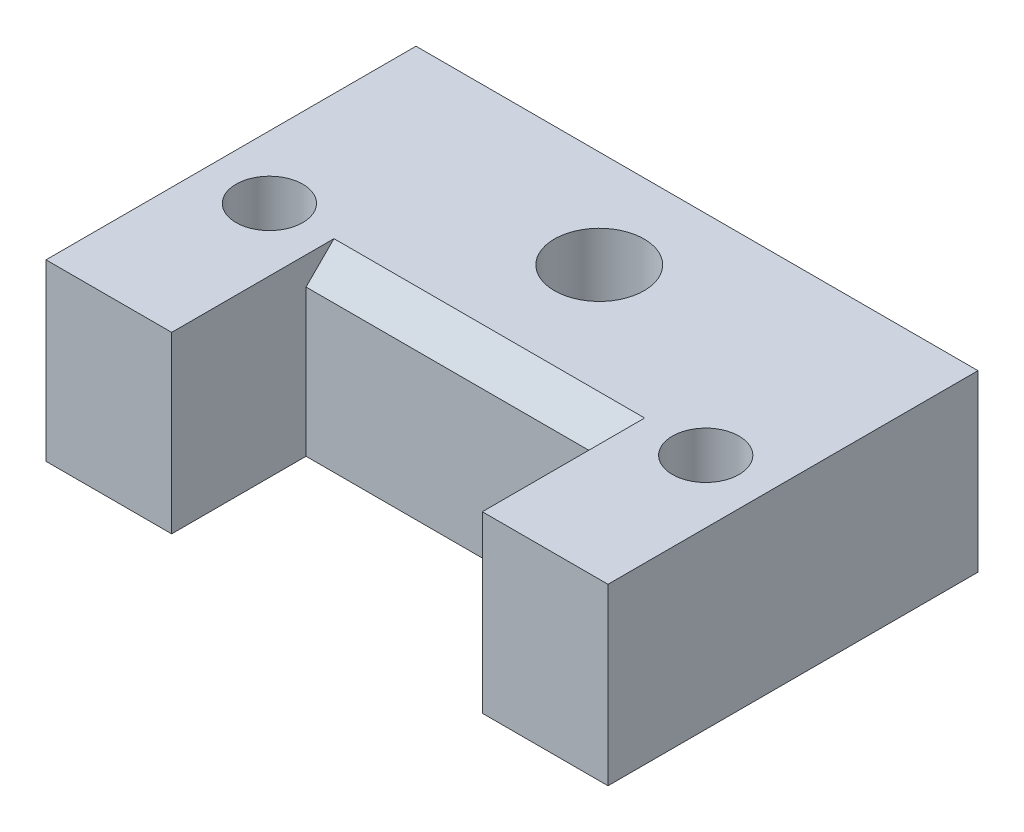
ISO-10303-21;
HEADER;
FILE_DESCRIPTION(('STEP AP214'),'2;1');
FILE_NAME('part.step','',(''),(''),'','','');
FILE_SCHEMA(('AUTOMOTIVE_DESIGN { 1 0 10303 214 1 1 1 1 }'));
ENDSEC;
DATA;
#1=APPLICATION_CONTEXT('core data for automotive mechanical design processes');
#2=APPLICATION_PROTOCOL_DEFINITION('international standard','automotive_design',2000,#1);
#3=PRODUCT_CONTEXT('',#1,'mechanical');
#4=PRODUCT('Part','Part','',(#3));
#5=PRODUCT_RELATED_PRODUCT_CATEGORY('part','',(#4));
#6=PRODUCT_DEFINITION_FORMATION('','',#4);
#7=PRODUCT_DEFINITION_CONTEXT('part definition',#1,'design');
#8=PRODUCT_DEFINITION('design','',#6,#7);
#9=PRODUCT_DEFINITION_SHAPE('','',#8);
#10=(LENGTH_UNIT() NAMED_UNIT(*) SI_UNIT(.MILLI.,.METRE.));
#11=(NAMED_UNIT(*) PLANE_ANGLE_UNIT() SI_UNIT($,.RADIAN.));
#12=(NAMED_UNIT(*) SI_UNIT($,.STERADIAN.) SOLID_ANGLE_UNIT());
#13=UNCERTAINTY_MEASURE_WITH_UNIT(LENGTH_MEASURE(1.E-05),#10,'distance_accuracy_value','');
#14=(GEOMETRIC_REPRESENTATION_CONTEXT(3) GLOBAL_UNCERTAINTY_ASSIGNED_CONTEXT((#13)) GLOBAL_UNIT_ASSIGNED_CONTEXT((#10,
#11,#12)) REPRESENTATION_CONTEXT('',''));
#15=CARTESIAN_POINT('',(0.,0.,0.));
#16=DIRECTION('',(0.,0.,1.));
#17=DIRECTION('',(1.,0.,0.));
#18=AXIS2_PLACEMENT_3D('',#15,#16,#17);
#19=CARTESIAN_POINT('',(-20.447,12.7,13.462));
#20=DIRECTION('',(0.,0.,-1.));
#21=DIRECTION('',(-1.,0.,0.));
#22=AXIS2_PLACEMENT_3D('',#19,#20,#21);
#23=PLANE('',#22);
#24=DIRECTION('',(1.,0.,0.));
#25=VECTOR('',#24,1.);
#26=CARTESIAN_POINT('',(-20.447,0.,13.462));
#27=LINE('',#26,#25);
#28=CARTESIAN_POINT('',(-20.447,0.,13.462));
#29=VERTEX_POINT('',#28);
#30=CARTESIAN_POINT('',(-11.303,0.,13.462));
#31=VERTEX_POINT('',#30);
#32=EDGE_CURVE('E136',#29,#31,#27,.T.);
#33=ORIENTED_EDGE('',*,*,#32,.T.);
#34=DIRECTION('',(0.,1.,0.));
#35=VECTOR('',#34,1.);
#36=CARTESIAN_POINT('',(-11.303,0.,13.462));
#37=LINE('',#36,#35);
#38=CARTESIAN_POINT('',(-11.303,12.7,13.462));
#39=VERTEX_POINT('',#38);
#40=EDGE_CURVE('E119',#31,#39,#37,.T.);
#41=ORIENTED_EDGE('',*,*,#40,.T.);
#42=DIRECTION('',(1.,0.,0.));
#43=VECTOR('',#42,1.);
#44=CARTESIAN_POINT('',(-20.447,12.7,13.462));
#45=LINE('',#44,#43);
#46=CARTESIAN_POINT('',(-20.447,12.7,13.462));
#47=VERTEX_POINT('',#46);
#48=EDGE_CURVE('E162',#47,#39,#45,.T.);
#49=ORIENTED_EDGE('',*,*,#48,.F.);
#50=DIRECTION('',(0.,-1.,0.));
#51=VECTOR('',#50,1.);
#52=CARTESIAN_POINT('',(-20.447,12.7,13.462));
#53=LINE('',#52,#51);
#54=EDGE_CURVE('E143',#47,#29,#53,.T.);
#55=ORIENTED_EDGE('',*,*,#54,.T.);
#56=EDGE_LOOP('',(#33,#41,#49,#55));
#57=FACE_BOUND('',#56,.T.);
#58=ADVANCED_FACE('F47',(#57),#23,.F.);
#59=CARTESIAN_POINT('',(20.447,12.7,-13.462));
#60=DIRECTION('',(-1.,0.,0.));
#61=DIRECTION('',(0.,0.,1.));
#62=AXIS2_PLACEMENT_3D('',#59,#60,#61);
#63=PLANE('',#62);
#64=DIRECTION('',(0.,0.,-1.));
#65=VECTOR('',#64,1.);
#66=CARTESIAN_POINT('',(20.447,0.,-13.462));
#67=LINE('',#66,#65);
#68=CARTESIAN_POINT('',(20.447,0.,13.462));
#69=VERTEX_POINT('',#68);
#70=CARTESIAN_POINT('',(20.447,0.,-13.462));
#71=VERTEX_POINT('',#70);
#72=EDGE_CURVE('E206',#69,#71,#67,.T.);
#73=ORIENTED_EDGE('',*,*,#72,.T.);
#74=DIRECTION('',(0.,-1.,0.));
#75=VECTOR('',#74,1.);
#76=CARTESIAN_POINT('',(20.447,12.7,-13.462));
#77=LINE('',#76,#75);
#78=CARTESIAN_POINT('',(20.447,12.7,-13.462));
#79=VERTEX_POINT('',#78);
#80=EDGE_CURVE('E169',#79,#71,#77,.T.);
#81=ORIENTED_EDGE('',*,*,#80,.F.);
#82=DIRECTION('',(0.,0.,-1.));
#83=VECTOR('',#82,1.);
#84=CARTESIAN_POINT('',(20.447,12.7,-13.462));
#85=LINE('',#84,#83);
#86=CARTESIAN_POINT('',(20.447,12.7,13.462));
#87=VERTEX_POINT('',#86);
#88=EDGE_CURVE('E145',#87,#79,#85,.T.);
#89=ORIENTED_EDGE('',*,*,#88,.F.);
#90=DIRECTION('',(0.,-1.,0.));
#91=VECTOR('',#90,1.);
#92=CARTESIAN_POINT('',(20.447,12.7,13.462));
#93=LINE('',#92,#91);
#94=EDGE_CURVE('E158',#87,#69,#93,.T.);
#95=ORIENTED_EDGE('',*,*,#94,.T.);
#96=EDGE_LOOP('',(#73,#81,#89,#95));
#97=FACE_BOUND('',#96,.T.);
#98=ADVANCED_FACE('F223',(#97),#63,.F.);
#99=CARTESIAN_POINT('',(-20.447,12.7,-13.462));
#100=DIRECTION('',(0.,0.,1.));
#101=DIRECTION('',(1.,0.,0.));
#102=AXIS2_PLACEMENT_3D('',#99,#100,#101);
#103=PLANE('',#102);
#104=DIRECTION('',(-1.,0.,0.));
#105=VECTOR('',#104,1.);
#106=CARTESIAN_POINT('',(-20.447,0.,-13.462));
#107=LINE('',#106,#105);
#108=CARTESIAN_POINT('',(-20.447,0.,-13.462));
#109=VERTEX_POINT('',#108);
#110=EDGE_CURVE('E209',#71,#109,#107,.T.);
#111=ORIENTED_EDGE('',*,*,#110,.T.);
#112=DIRECTION('',(0.,-1.,0.));
#113=VECTOR('',#112,1.);
#114=CARTESIAN_POINT('',(-20.447,12.7,-13.462));
#115=LINE('',#114,#113);
#116=CARTESIAN_POINT('',(-20.447,12.7,-13.462));
#117=VERTEX_POINT('',#116);
#118=EDGE_CURVE('E165',#117,#109,#115,.T.);
#119=ORIENTED_EDGE('',*,*,#118,.F.);
#120=DIRECTION('',(-1.,0.,0.));
#121=VECTOR('',#120,1.);
#122=CARTESIAN_POINT('',(-20.447,12.7,-13.462));
#123=LINE('',#122,#121);
#124=EDGE_CURVE('E152',#79,#117,#123,.T.);
#125=ORIENTED_EDGE('',*,*,#124,.F.);
#126=ORIENTED_EDGE('',*,*,#80,.T.);
#127=EDGE_LOOP('',(#111,#119,#125,#126));
#128=FACE_BOUND('',#127,.T.);
#129=ADVANCED_FACE('F221',(#128),#103,.F.);
#130=CARTESIAN_POINT('',(-20.447,12.7,-13.462));
#131=DIRECTION('',(1.,0.,0.));
#132=DIRECTION('',(0.,0.,-1.));
#133=AXIS2_PLACEMENT_3D('',#130,#131,#132);
#134=PLANE('',#133);
#135=DIRECTION('',(0.,0.,1.));
#136=VECTOR('',#135,1.);
#137=CARTESIAN_POINT('',(-20.447,0.,-13.462));
#138=LINE('',#137,#136);
#139=EDGE_CURVE('E154',#109,#29,#138,.T.);
#140=ORIENTED_EDGE('',*,*,#139,.T.);
#141=ORIENTED_EDGE('',*,*,#54,.F.);
#142=DIRECTION('',(0.,0.,1.));
#143=VECTOR('',#142,1.);
#144=CARTESIAN_POINT('',(-20.447,12.7,-13.462));
#145=LINE('',#144,#143);
#146=EDGE_CURVE('E198',#117,#47,#145,.T.);
#147=ORIENTED_EDGE('',*,*,#146,.F.);
#148=ORIENTED_EDGE('',*,*,#118,.T.);
#149=EDGE_LOOP('',(#140,#141,#147,#148));
#150=FACE_BOUND('',#149,.T.);
#151=ADVANCED_FACE('F217',(#150),#134,.F.);
#152=CARTESIAN_POINT('',(11.303,12.7,13.462));
#153=VERTEX_POINT('',#152);
#154=EDGE_CURVE('E188',#153,#87,#45,.T.);
#155=ORIENTED_EDGE('',*,*,#154,.F.);
#156=DIRECTION('',(0.,1.,0.));
#157=VECTOR('',#156,1.);
#158=CARTESIAN_POINT('',(11.303,0.,13.462));
#159=LINE('',#158,#157);
#160=CARTESIAN_POINT('',(11.303,0.,13.462));
#161=VERTEX_POINT('',#160);
#162=EDGE_CURVE('E129',#161,#153,#159,.T.);
#163=ORIENTED_EDGE('',*,*,#162,.F.);
#164=EDGE_CURVE('E146',#161,#69,#27,.T.);
#165=ORIENTED_EDGE('',*,*,#164,.T.);
#166=ORIENTED_EDGE('',*,*,#94,.F.);
#167=EDGE_LOOP('',(#155,#163,#165,#166));
#168=FACE_BOUND('',#167,.T.);
#169=ADVANCED_FACE('F194',(#168),#23,.F.);
#170=CARTESIAN_POINT('',(0.,12.7,0.));
#171=DIRECTION('',(0.,1.,0.));
#172=DIRECTION('',(0.,0.,1.));
#173=AXIS2_PLACEMENT_3D('',#170,#171,#172);
#174=PLANE('',#173);
#175=CARTESIAN_POINT('',(0.,12.7,-6.35));
#176=DIRECTION('',(0.,1.,0.));
#177=DIRECTION('',(0.,0.,1.));
#178=AXIS2_PLACEMENT_3D('',#175,#176,#177);
#179=CIRCLE('',#178,3.26389999999999);
#180=CARTESIAN_POINT('',(0.,12.7,-3.08610000000002));
#181=VERTEX_POINT('',#180);
#182=EDGE_CURVE('E261',#181,#181,#179,.T.);
#183=ORIENTED_EDGE('',*,*,#182,.F.);
#184=EDGE_LOOP('',(#183));
#185=FACE_BOUND('',#184,.T.);
#186=CARTESIAN_POINT('',(-15.875,12.7,1.77799999999999));
#187=DIRECTION('',(0.,1.,0.));
#188=DIRECTION('',(0.,0.,1.));
#189=AXIS2_PLACEMENT_3D('',#186,#187,#188);
#190=CIRCLE('',#189,2.4257);
#191=CARTESIAN_POINT('',(-15.875,12.7,4.20369999999999));
#192=VERTEX_POINT('',#191);
#193=EDGE_CURVE('E251',#192,#192,#190,.T.);
#194=ORIENTED_EDGE('',*,*,#193,.F.);
#195=EDGE_LOOP('',(#194));
#196=FACE_BOUND('',#195,.T.);
#197=CARTESIAN_POINT('',(15.875,12.7,1.77799999999999));
#198=DIRECTION('',(0.,1.,0.));
#199=DIRECTION('',(0.,0.,1.));
#200=AXIS2_PLACEMENT_3D('',#197,#198,#199);
#201=CIRCLE('',#200,2.4257);
#202=CARTESIAN_POINT('',(15.875,12.7,4.20369999999999));
#203=VERTEX_POINT('',#202);
#204=EDGE_CURVE('E246',#203,#203,#201,.T.);
#205=ORIENTED_EDGE('',*,*,#204,.F.);
#206=EDGE_LOOP('',(#205));
#207=FACE_BOUND('',#206,.T.);
#208=DIRECTION('',(0.,0.,1.));
#209=VECTOR('',#208,1.);
#210=CARTESIAN_POINT('',(-11.303,12.7,13.462));
#211=LINE('',#210,#209);
#212=CARTESIAN_POINT('',(-11.303,12.7,1.65099999999999));
#213=VERTEX_POINT('',#212);
#214=EDGE_CURVE('E64',#213,#39,#211,.T.);
#215=ORIENTED_EDGE('',*,*,#214,.F.);
#216=DIRECTION('',(1.,0.,0.));
#217=VECTOR('',#216,1.);
#218=CARTESIAN_POINT('',(11.303,12.7,1.65099999999999));
#219=LINE('',#218,#217);
#220=CARTESIAN_POINT('',(11.303,12.7,1.65099999999999));
#221=VERTEX_POINT('',#220);
#222=EDGE_CURVE('E177',#213,#221,#219,.T.);
#223=ORIENTED_EDGE('',*,*,#222,.T.);
#224=DIRECTION('',(0.,0.,-1.));
#225=VECTOR('',#224,1.);
#226=CARTESIAN_POINT('',(11.303,12.7,13.462));
#227=LINE('',#226,#225);
#228=EDGE_CURVE('E71',#153,#221,#227,.T.);
#229=ORIENTED_EDGE('',*,*,#228,.F.);
#230=ORIENTED_EDGE('',*,*,#154,.T.);
#231=ORIENTED_EDGE('',*,*,#88,.T.);
#232=ORIENTED_EDGE('',*,*,#124,.T.);
#233=ORIENTED_EDGE('',*,*,#146,.T.);
#234=ORIENTED_EDGE('',*,*,#48,.T.);
#235=EDGE_LOOP('',(#215,#223,#229,#230,#231,#232,#233,#234));
#236=FACE_BOUND('',#235,.T.);
#237=ADVANCED_FACE('F186',(#185,#196,#207,#236),#174,.T.);
#238=CARTESIAN_POINT('',(0.,0.,0.));
#239=DIRECTION('',(0.,1.,0.));
#240=DIRECTION('',(0.,0.,1.));
#241=AXIS2_PLACEMENT_3D('',#238,#239,#240);
#242=PLANE('',#241);
#243=CARTESIAN_POINT('',(0.,0.,-6.35));
#244=DIRECTION('',(0.,1.,0.));
#245=DIRECTION('',(0.,0.,1.));
#246=AXIS2_PLACEMENT_3D('',#243,#244,#245);
#247=CIRCLE('',#246,3.2639);
#248=CARTESIAN_POINT('',(0.,0.,-3.08610000000001));
#249=VERTEX_POINT('',#248);
#250=EDGE_CURVE('E247',#249,#249,#247,.T.);
#251=ORIENTED_EDGE('',*,*,#250,.T.);
#252=EDGE_LOOP('',(#251));
#253=FACE_BOUND('',#252,.T.);
#254=CARTESIAN_POINT('',(-15.875,0.,1.77799999999999));
#255=DIRECTION('',(0.,1.,0.));
#256=DIRECTION('',(0.,0.,1.));
#257=AXIS2_PLACEMENT_3D('',#254,#255,#256);
#258=CIRCLE('',#257,2.4257);
#259=CARTESIAN_POINT('',(-15.875,0.,4.20369999999999));
#260=VERTEX_POINT('',#259);
#261=EDGE_CURVE('E237',#260,#260,#258,.T.);
#262=ORIENTED_EDGE('',*,*,#261,.T.);
#263=EDGE_LOOP('',(#262));
#264=FACE_BOUND('',#263,.T.);
#265=CARTESIAN_POINT('',(15.875,0.,1.77799999999999));
#266=DIRECTION('',(0.,1.,0.));
#267=DIRECTION('',(0.,0.,1.));
#268=AXIS2_PLACEMENT_3D('',#265,#266,#267);
#269=CIRCLE('',#268,2.4257);
#270=CARTESIAN_POINT('',(15.875,0.,4.20369999999999));
#271=VERTEX_POINT('',#270);
#272=EDGE_CURVE('E242',#271,#271,#269,.T.);
#273=ORIENTED_EDGE('',*,*,#272,.T.);
#274=EDGE_LOOP('',(#273));
#275=FACE_BOUND('',#274,.T.);
#276=DIRECTION('',(-1.,0.,0.));
#277=VECTOR('',#276,1.);
#278=CARTESIAN_POINT('',(-11.303,0.,3.683));
#279=LINE('',#278,#277);
#280=CARTESIAN_POINT('',(11.303,0.,3.683));
#281=VERTEX_POINT('',#280);
#282=CARTESIAN_POINT('',(-11.303,0.,3.683));
#283=VERTEX_POINT('',#282);
#284=EDGE_CURVE('E130',#281,#283,#279,.T.);
#285=ORIENTED_EDGE('',*,*,#284,.T.);
#286=DIRECTION('',(0.,0.,1.));
#287=VECTOR('',#286,1.);
#288=CARTESIAN_POINT('',(-11.303,0.,13.462));
#289=LINE('',#288,#287);
#290=EDGE_CURVE('E123',#283,#31,#289,.T.);
#291=ORIENTED_EDGE('',*,*,#290,.T.);
#292=ORIENTED_EDGE('',*,*,#32,.F.);
#293=ORIENTED_EDGE('',*,*,#139,.F.);
#294=ORIENTED_EDGE('',*,*,#110,.F.);
#295=ORIENTED_EDGE('',*,*,#72,.F.);
#296=ORIENTED_EDGE('',*,*,#164,.F.);
#297=DIRECTION('',(0.,0.,-1.));
#298=VECTOR('',#297,1.);
#299=CARTESIAN_POINT('',(11.303,0.,13.462));
#300=LINE('',#299,#298);
#301=EDGE_CURVE('E139',#161,#281,#300,.T.);
#302=ORIENTED_EDGE('',*,*,#301,.T.);
#303=EDGE_LOOP('',(#285,#291,#292,#293,#294,#295,#296,#302));
#304=FACE_BOUND('',#303,.T.);
#305=ADVANCED_FACE('F134',(#253,#264,#275,#304),#242,.F.);
#306=CARTESIAN_POINT('',(-11.303,0.,13.462));
#307=DIRECTION('',(-1.,0.,0.));
#308=DIRECTION('',(0.,0.,1.));
#309=AXIS2_PLACEMENT_3D('',#306,#307,#308);
#310=PLANE('',#309);
#311=ORIENTED_EDGE('',*,*,#214,.T.);
#312=ORIENTED_EDGE('',*,*,#40,.F.);
#313=ORIENTED_EDGE('',*,*,#290,.F.);
#314=DIRECTION('',(0.,1.,0.));
#315=VECTOR('',#314,1.);
#316=CARTESIAN_POINT('',(-11.303,0.,3.683));
#317=LINE('',#316,#315);
#318=CARTESIAN_POINT('',(-11.303,10.668,3.683));
#319=VERTEX_POINT('',#318);
#320=EDGE_CURVE('E182',#283,#319,#317,.T.);
#321=ORIENTED_EDGE('',*,*,#320,.T.);
#322=DIRECTION('',(0.,0.707106781186546,-0.707106781186549));
#323=VECTOR('',#322,1.);
#324=CARTESIAN_POINT('',(-11.303,0.444500000000016,13.9065));
#325=LINE('',#324,#323);
#326=EDGE_CURVE('E57',#319,#213,#325,.T.);
#327=ORIENTED_EDGE('',*,*,#326,.T.);
#328=EDGE_LOOP('',(#311,#312,#313,#321,#327));
#329=FACE_BOUND('',#328,.T.);
#330=ADVANCED_FACE('F121',(#329),#310,.F.);
#331=CARTESIAN_POINT('',(-11.303,0.,3.683));
#332=DIRECTION('',(0.,0.,-1.));
#333=DIRECTION('',(-1.,0.,0.));
#334=AXIS2_PLACEMENT_3D('',#331,#332,#333);
#335=PLANE('',#334);
#336=DIRECTION('',(0.,1.,0.));
#337=VECTOR('',#336,1.);
#338=CARTESIAN_POINT('',(11.303,0.,3.683));
#339=LINE('',#338,#337);
#340=CARTESIAN_POINT('',(11.303,10.668,3.683));
#341=VERTEX_POINT('',#340);
#342=EDGE_CURVE('E229',#281,#341,#339,.T.);
#343=ORIENTED_EDGE('',*,*,#342,.T.);
#344=DIRECTION('',(-1.,0.,0.));
#345=VECTOR('',#344,1.);
#346=CARTESIAN_POINT('',(-11.303,10.668,3.683));
#347=LINE('',#346,#345);
#348=EDGE_CURVE('E173',#341,#319,#347,.T.);
#349=ORIENTED_EDGE('',*,*,#348,.T.);
#350=ORIENTED_EDGE('',*,*,#320,.F.);
#351=ORIENTED_EDGE('',*,*,#284,.F.);
#352=EDGE_LOOP('',(#343,#349,#350,#351));
#353=FACE_BOUND('',#352,.T.);
#354=ADVANCED_FACE('F288',(#353),#335,.F.);
#355=CARTESIAN_POINT('',(11.303,0.,13.462));
#356=DIRECTION('',(1.,0.,0.));
#357=DIRECTION('',(0.,0.,-1.));
#358=AXIS2_PLACEMENT_3D('',#355,#356,#357);
#359=PLANE('',#358);
#360=ORIENTED_EDGE('',*,*,#228,.T.);
#361=DIRECTION('',(0.,-0.707106781186546,0.707106781186549));
#362=VECTOR('',#361,1.);
#363=CARTESIAN_POINT('',(11.303,0.444500000000018,13.9065));
#364=LINE('',#363,#362);
#365=EDGE_CURVE('E11',#221,#341,#364,.T.);
#366=ORIENTED_EDGE('',*,*,#365,.T.);
#367=ORIENTED_EDGE('',*,*,#342,.F.);
#368=ORIENTED_EDGE('',*,*,#301,.F.);
#369=ORIENTED_EDGE('',*,*,#162,.T.);
#370=EDGE_LOOP('',(#360,#366,#367,#368,#369));
#371=FACE_BOUND('',#370,.T.);
#372=ADVANCED_FACE('F279',(#371),#359,.F.);
#373=CARTESIAN_POINT('',(15.875,0.,1.77799999999999));
#374=DIRECTION('',(0.,1.,0.));
#375=DIRECTION('',(0.,0.,1.));
#376=AXIS2_PLACEMENT_3D('',#373,#374,#375);
#377=CYLINDRICAL_SURFACE('',#376,2.4257);
#378=ORIENTED_EDGE('',*,*,#272,.F.);
#379=EDGE_LOOP('',(#378));
#380=FACE_BOUND('',#379,.T.);
#381=ORIENTED_EDGE('',*,*,#204,.T.);
#382=EDGE_LOOP('',(#381));
#383=FACE_BOUND('',#382,.T.);
#384=ADVANCED_FACE('F276',(#380,#383),#377,.F.);
#385=CARTESIAN_POINT('',(-15.875,0.,1.77799999999999));
#386=DIRECTION('',(0.,1.,0.));
#387=DIRECTION('',(0.,0.,1.));
#388=AXIS2_PLACEMENT_3D('',#385,#386,#387);
#389=CYLINDRICAL_SURFACE('',#388,2.4257);
#390=ORIENTED_EDGE('',*,*,#261,.F.);
#391=EDGE_LOOP('',(#390));
#392=FACE_BOUND('',#391,.T.);
#393=ORIENTED_EDGE('',*,*,#193,.T.);
#394=EDGE_LOOP('',(#393));
#395=FACE_BOUND('',#394,.T.);
#396=ADVANCED_FACE('F278',(#392,#395),#389,.F.);
#397=CARTESIAN_POINT('',(0.,12.7,-6.35));
#398=DIRECTION('',(0.,1.,0.));
#399=DIRECTION('',(0.,0.,1.));
#400=AXIS2_PLACEMENT_3D('',#397,#398,#399);
#401=CYLINDRICAL_SURFACE('',#400,3.26389999999999);
#402=ORIENTED_EDGE('',*,*,#250,.F.);
#403=EDGE_LOOP('',(#402));
#404=FACE_BOUND('',#403,.T.);
#405=ORIENTED_EDGE('',*,*,#182,.T.);
#406=EDGE_LOOP('',(#405));
#407=FACE_BOUND('',#406,.T.);
#408=ADVANCED_FACE('F267',(#404,#407),#401,.F.);
#409=CARTESIAN_POINT('',(-11.303,10.668,3.683));
#410=DIRECTION('',(0.,0.707106781186549,0.707106781186546));
#411=DIRECTION('',(1.,0.,0.));
#412=AXIS2_PLACEMENT_3D('',#409,#410,#411);
#413=PLANE('',#412);
#414=ORIENTED_EDGE('',*,*,#365,.F.);
#415=ORIENTED_EDGE('',*,*,#222,.F.);
#416=ORIENTED_EDGE('',*,*,#326,.F.);
#417=ORIENTED_EDGE('',*,*,#348,.F.);
#418=EDGE_LOOP('',(#414,#415,#416,#417));
#419=FACE_BOUND('',#418,.T.);
#420=ADVANCED_FACE('F50',(#419),#413,.T.);
#421=CLOSED_SHELL('',(#58,#98,#129,#151,#169,#237,#305,#330,#354,#372,#384,#396,#408,#420));
#422=MANIFOLD_SOLID_BREP('B2',#421);
#423=ADVANCED_BREP_SHAPE_REPRESENTATION('',(#18,#422),#14);
#424=SHAPE_DEFINITION_REPRESENTATION(#9,#423);
ENDSEC;
END-ISO-10303-21;
